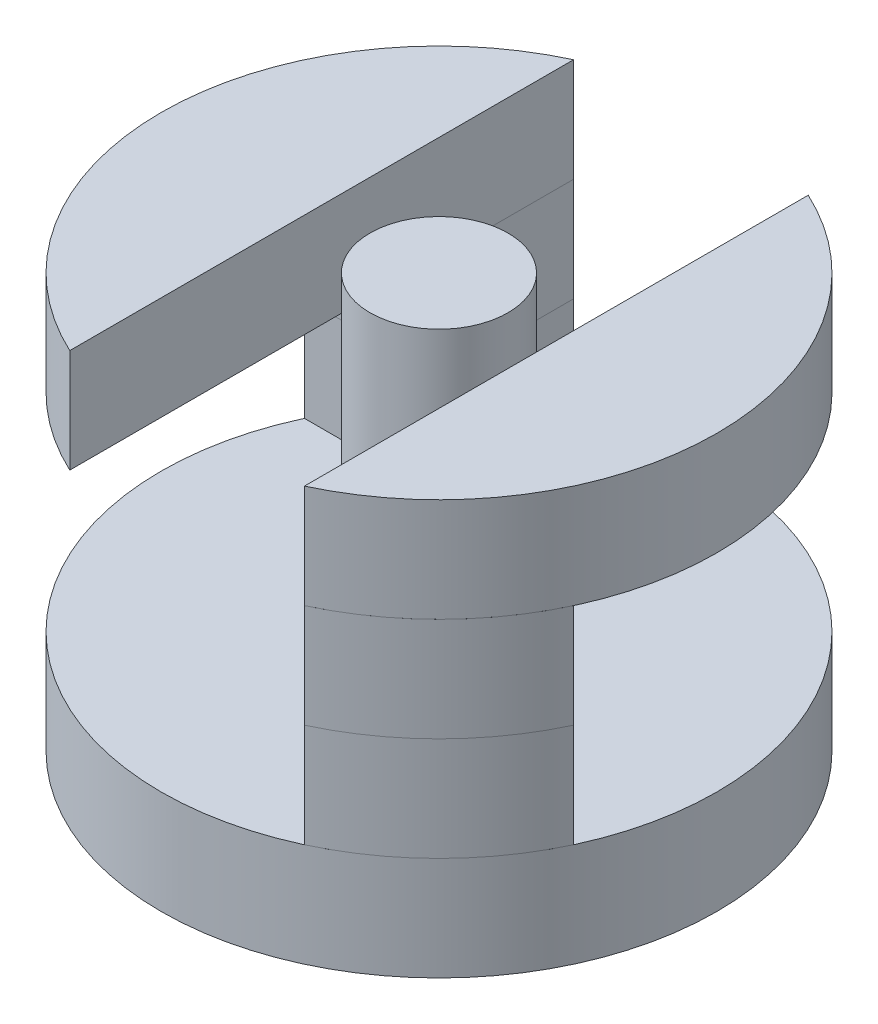
ISO-10303-21;
HEADER;
FILE_DESCRIPTION(('STEP AP214'),'2;1');
FILE_NAME('part.step','',(''),(''),'','','');
FILE_SCHEMA(('AUTOMOTIVE_DESIGN { 1 0 10303 214 1 1 1 1 }'));
ENDSEC;
DATA;
#1=APPLICATION_CONTEXT('core data for automotive mechanical design processes');
#2=APPLICATION_PROTOCOL_DEFINITION('international standard','automotive_design',2000,#1);
#3=PRODUCT_CONTEXT('',#1,'mechanical');
#4=PRODUCT('Part','Part','',(#3));
#5=PRODUCT_RELATED_PRODUCT_CATEGORY('part','',(#4));
#6=PRODUCT_DEFINITION_FORMATION('','',#4);
#7=PRODUCT_DEFINITION_CONTEXT('part definition',#1,'design');
#8=PRODUCT_DEFINITION('design','',#6,#7);
#9=PRODUCT_DEFINITION_SHAPE('','',#8);
#10=(LENGTH_UNIT() NAMED_UNIT(*) SI_UNIT(.MILLI.,.METRE.));
#11=(NAMED_UNIT(*) PLANE_ANGLE_UNIT() SI_UNIT($,.RADIAN.));
#12=(NAMED_UNIT(*) SI_UNIT($,.STERADIAN.) SOLID_ANGLE_UNIT());
#13=UNCERTAINTY_MEASURE_WITH_UNIT(LENGTH_MEASURE(1.E-05),#10,'distance_accuracy_value','');
#14=(GEOMETRIC_REPRESENTATION_CONTEXT(3) GLOBAL_UNCERTAINTY_ASSIGNED_CONTEXT((#13)) GLOBAL_UNIT_ASSIGNED_CONTEXT((#10,
#11,#12)) REPRESENTATION_CONTEXT('',''));
#15=CARTESIAN_POINT('',(0.,0.,0.));
#16=DIRECTION('',(0.,0.,1.));
#17=DIRECTION('',(1.,0.,0.));
#18=AXIS2_PLACEMENT_3D('',#15,#16,#17);
#19=CARTESIAN_POINT('',(-21.5900000000003,47.6250000000001,46.3483468102152));
#20=DIRECTION('',(1.,0.,0.));
#21=DIRECTION('',(0.,1.,0.));
#22=AXIS2_PLACEMENT_3D('',#19,#20,#21);
#23=PLANE('',#22);
#24=DIRECTION('',(0.,0.,-1.));
#25=VECTOR('',#24,1.);
#26=CARTESIAN_POINT('',(-21.5900000000003,66.6750000000001,46.3483468102152));
#27=LINE('',#26,#25);
#28=CARTESIAN_POINT('',(-21.5900000000003,66.6750000000001,46.3483468102152));
#29=VERTEX_POINT('',#28);
#30=CARTESIAN_POINT('',(-21.5899999999997,66.6750000000001,-46.3483468102155));
#31=VERTEX_POINT('',#30);
#32=EDGE_CURVE('P0_E48',#29,#31,#27,.T.);
#33=ORIENTED_EDGE('',*,*,#32,.F.);
#34=DIRECTION('',(0.,1.,0.));
#35=VECTOR('',#34,1.);
#36=CARTESIAN_POINT('',(-21.5900000000003,47.6250000000001,46.3483468102152));
#37=LINE('',#36,#35);
#38=CARTESIAN_POINT('',(-21.5900000000003,47.6250000000001,46.3483468102152));
#39=VERTEX_POINT('',#38);
#40=EDGE_CURVE('P0_E11',#39,#29,#37,.T.);
#41=ORIENTED_EDGE('',*,*,#40,.F.);
#42=DIRECTION('',(0.,0.,-1.));
#43=VECTOR('',#42,1.);
#44=CARTESIAN_POINT('',(-21.5900000000003,47.6250000000001,46.3483468102152));
#45=LINE('',#44,#43);
#46=CARTESIAN_POINT('',(-21.5899999999997,47.6250000000001,-46.3483468102155));
#47=VERTEX_POINT('',#46);
#48=EDGE_CURVE('P0_E49',#39,#47,#45,.T.);
#49=ORIENTED_EDGE('',*,*,#48,.T.);
#50=DIRECTION('',(0.,1.,0.));
#51=VECTOR('',#50,1.);
#52=CARTESIAN_POINT('',(-21.5899999999997,47.6250000000001,-46.3483468102155));
#53=LINE('',#52,#51);
#54=EDGE_CURVE('P0_E20',#47,#31,#53,.T.);
#55=ORIENTED_EDGE('',*,*,#54,.T.);
#56=EDGE_LOOP('',(#33,#41,#49,#55));
#57=FACE_BOUND('',#56,.T.);
#58=ADVANCED_FACE('P0_F17',(#57),#23,.T.);
#59=CARTESIAN_POINT('',(0.,47.6250000000001,0.));
#60=DIRECTION('',(0.,1.,0.));
#61=DIRECTION('',(-1.,0.,0.));
#62=AXIS2_PLACEMENT_3D('',#59,#60,#61);
#63=CYLINDRICAL_SURFACE('',#62,51.1302);
#64=CARTESIAN_POINT('',(0.,66.6750000000001,0.));
#65=DIRECTION('',(0.,-1.,0.));
#66=DIRECTION('',(1.,0.,0.));
#67=AXIS2_PLACEMENT_3D('',#64,#65,#66);
#68=CIRCLE('',#67,51.1302);
#69=EDGE_CURVE('P0_E42',#29,#31,#68,.T.);
#70=ORIENTED_EDGE('',*,*,#69,.T.);
#71=ORIENTED_EDGE('',*,*,#54,.F.);
#72=CARTESIAN_POINT('',(0.,47.6250000000001,0.));
#73=DIRECTION('',(0.,-1.,0.));
#74=DIRECTION('',(1.,0.,0.));
#75=AXIS2_PLACEMENT_3D('',#72,#73,#74);
#76=CIRCLE('',#75,51.1302);
#77=EDGE_CURVE('P0_E44',#39,#47,#76,.T.);
#78=ORIENTED_EDGE('',*,*,#77,.F.);
#79=ORIENTED_EDGE('',*,*,#40,.T.);
#80=EDGE_LOOP('',(#70,#71,#78,#79));
#81=FACE_BOUND('',#80,.T.);
#82=ADVANCED_FACE('P0_F41',(#81),#63,.T.);
#83=CARTESIAN_POINT('',(0.,47.6250000000001,0.));
#84=DIRECTION('',(0.,-1.,0.));
#85=DIRECTION('',(1.,0.,0.));
#86=AXIS2_PLACEMENT_3D('',#83,#84,#85);
#87=PLANE('',#86);
#88=ORIENTED_EDGE('',*,*,#48,.F.);
#89=ORIENTED_EDGE('',*,*,#77,.T.);
#90=EDGE_LOOP('',(#88,#89));
#91=FACE_BOUND('',#90,.T.);
#92=ADVANCED_FACE('P0_F55',(#91),#87,.T.);
#93=CARTESIAN_POINT('',(0.,66.6750000000001,0.));
#94=DIRECTION('',(0.,-1.,0.));
#95=DIRECTION('',(1.,0.,0.));
#96=AXIS2_PLACEMENT_3D('',#93,#94,#95);
#97=PLANE('',#96);
#98=ORIENTED_EDGE('',*,*,#32,.T.);
#99=ORIENTED_EDGE('',*,*,#69,.F.);
#100=EDGE_LOOP('',(#98,#99));
#101=FACE_BOUND('',#100,.T.);
#102=ADVANCED_FACE('P0_F47',(#101),#97,.F.);
#103=CLOSED_SHELL('',(#58,#82,#92,#102));
#104=MANIFOLD_SOLID_BREP('P0_B1',#103);
#105=CARTESIAN_POINT('',(21.5900000000003,66.6750000000001,46.3483468102152));
#106=DIRECTION('',(-1.,0.,0.));
#107=DIRECTION('',(0.,-1.,0.));
#108=AXIS2_PLACEMENT_3D('',#105,#106,#107);
#109=PLANE('',#108);
#110=DIRECTION('',(0.,0.,-1.));
#111=VECTOR('',#110,1.);
#112=CARTESIAN_POINT('',(21.5900000000003,47.6250000000001,46.3483468102152));
#113=LINE('',#112,#111);
#114=CARTESIAN_POINT('',(21.5900000000003,47.6250000000001,46.3483468102152));
#115=VERTEX_POINT('',#114);
#116=CARTESIAN_POINT('',(21.5899999999997,47.6250000000001,-46.3483468102155));
#117=VERTEX_POINT('',#116);
#118=EDGE_CURVE('P1_E48',#115,#117,#113,.T.);
#119=ORIENTED_EDGE('',*,*,#118,.F.);
#120=DIRECTION('',(0.,-1.,0.));
#121=VECTOR('',#120,1.);
#122=CARTESIAN_POINT('',(21.5900000000003,66.6750000000001,46.3483468102152));
#123=LINE('',#122,#121);
#124=CARTESIAN_POINT('',(21.5900000000003,66.6750000000001,46.3483468102152));
#125=VERTEX_POINT('',#124);
#126=EDGE_CURVE('P1_E11',#125,#115,#123,.T.);
#127=ORIENTED_EDGE('',*,*,#126,.F.);
#128=DIRECTION('',(0.,0.,-1.));
#129=VECTOR('',#128,1.);
#130=CARTESIAN_POINT('',(21.5900000000003,66.6750000000001,46.3483468102152));
#131=LINE('',#130,#129);
#132=CARTESIAN_POINT('',(21.5899999999997,66.6750000000001,-46.3483468102155));
#133=VERTEX_POINT('',#132);
#134=EDGE_CURVE('P1_E49',#125,#133,#131,.T.);
#135=ORIENTED_EDGE('',*,*,#134,.T.);
#136=DIRECTION('',(0.,-1.,0.));
#137=VECTOR('',#136,1.);
#138=CARTESIAN_POINT('',(21.5899999999997,66.6750000000001,-46.3483468102155));
#139=LINE('',#138,#137);
#140=EDGE_CURVE('P1_E20',#133,#117,#139,.T.);
#141=ORIENTED_EDGE('',*,*,#140,.T.);
#142=EDGE_LOOP('',(#119,#127,#135,#141));
#143=FACE_BOUND('',#142,.T.);
#144=ADVANCED_FACE('P1_F17',(#143),#109,.T.);
#145=CARTESIAN_POINT('',(0.,66.6750000000001,0.));
#146=DIRECTION('',(0.,-1.,0.));
#147=DIRECTION('',(1.,0.,0.));
#148=AXIS2_PLACEMENT_3D('',#145,#146,#147);
#149=CYLINDRICAL_SURFACE('',#148,51.1302);
#150=CARTESIAN_POINT('',(0.,47.6250000000001,0.));
#151=DIRECTION('',(0.,1.,0.));
#152=DIRECTION('',(-1.,0.,0.));
#153=AXIS2_PLACEMENT_3D('',#150,#151,#152);
#154=CIRCLE('',#153,51.1302);
#155=EDGE_CURVE('P1_E42',#115,#117,#154,.T.);
#156=ORIENTED_EDGE('',*,*,#155,.T.);
#157=ORIENTED_EDGE('',*,*,#140,.F.);
#158=CARTESIAN_POINT('',(0.,66.6750000000001,0.));
#159=DIRECTION('',(0.,1.,0.));
#160=DIRECTION('',(-1.,0.,0.));
#161=AXIS2_PLACEMENT_3D('',#158,#159,#160);
#162=CIRCLE('',#161,51.1302);
#163=EDGE_CURVE('P1_E44',#125,#133,#162,.T.);
#164=ORIENTED_EDGE('',*,*,#163,.F.);
#165=ORIENTED_EDGE('',*,*,#126,.T.);
#166=EDGE_LOOP('',(#156,#157,#164,#165));
#167=FACE_BOUND('',#166,.T.);
#168=ADVANCED_FACE('P1_F41',(#167),#149,.T.);
#169=CARTESIAN_POINT('',(0.,66.6750000000001,0.));
#170=DIRECTION('',(0.,1.,0.));
#171=DIRECTION('',(-1.,0.,0.));
#172=AXIS2_PLACEMENT_3D('',#169,#170,#171);
#173=PLANE('',#172);
#174=ORIENTED_EDGE('',*,*,#134,.F.);
#175=ORIENTED_EDGE('',*,*,#163,.T.);
#176=EDGE_LOOP('',(#174,#175));
#177=FACE_BOUND('',#176,.T.);
#178=ADVANCED_FACE('P1_F55',(#177),#173,.T.);
#179=CARTESIAN_POINT('',(0.,47.6250000000001,0.));
#180=DIRECTION('',(0.,1.,0.));
#181=DIRECTION('',(-1.,0.,0.));
#182=AXIS2_PLACEMENT_3D('',#179,#180,#181);
#183=PLANE('',#182);
#184=ORIENTED_EDGE('',*,*,#118,.T.);
#185=ORIENTED_EDGE('',*,*,#155,.F.);
#186=EDGE_LOOP('',(#184,#185));
#187=FACE_BOUND('',#186,.T.);
#188=ADVANCED_FACE('P1_F47',(#187),#183,.F.);
#189=CLOSED_SHELL('',(#144,#168,#178,#188));
#190=MANIFOLD_SOLID_BREP('P1_B1',#189);
#191=CARTESIAN_POINT('',(46.3483468102153,9.525,21.59));
#192=DIRECTION('',(0.,0.,-1.));
#193=DIRECTION('',(1.,0.,0.));
#194=AXIS2_PLACEMENT_3D('',#191,#192,#193);
#195=PLANE('',#194);
#196=DIRECTION('',(-1.,0.,0.));
#197=VECTOR('',#196,1.);
#198=CARTESIAN_POINT('',(46.3483468102153,28.575,21.59));
#199=LINE('',#198,#197);
#200=CARTESIAN_POINT('',(46.3483468102153,28.575,21.59));
#201=VERTEX_POINT('',#200);
#202=CARTESIAN_POINT('',(21.59,28.575,21.59));
#203=VERTEX_POINT('',#202);
#204=EDGE_CURVE('P2_E69',#201,#203,#199,.T.);
#205=ORIENTED_EDGE('',*,*,#204,.F.);
#206=DIRECTION('',(0.,1.,0.));
#207=VECTOR('',#206,1.);
#208=CARTESIAN_POINT('',(46.3483468102153,9.525,21.59));
#209=LINE('',#208,#207);
#210=CARTESIAN_POINT('',(46.3483468102153,9.525,21.59));
#211=VERTEX_POINT('',#210);
#212=EDGE_CURVE('P2_E11',#211,#201,#209,.T.);
#213=ORIENTED_EDGE('',*,*,#212,.F.);
#214=DIRECTION('',(-1.,0.,0.));
#215=VECTOR('',#214,1.);
#216=CARTESIAN_POINT('',(46.3483468102153,9.525,21.59));
#217=LINE('',#216,#215);
#218=CARTESIAN_POINT('',(21.59,9.525,21.59));
#219=VERTEX_POINT('',#218);
#220=EDGE_CURVE('P2_E62',#211,#219,#217,.T.);
#221=ORIENTED_EDGE('',*,*,#220,.T.);
#222=DIRECTION('',(0.,1.,0.));
#223=VECTOR('',#222,1.);
#224=CARTESIAN_POINT('',(21.59,9.525,21.59));
#225=LINE('',#224,#223);
#226=EDGE_CURVE('P2_E20',#219,#203,#225,.T.);
#227=ORIENTED_EDGE('',*,*,#226,.T.);
#228=EDGE_LOOP('',(#205,#213,#221,#227));
#229=FACE_BOUND('',#228,.T.);
#230=ADVANCED_FACE('P2_F17',(#229),#195,.T.);
#231=CARTESIAN_POINT('',(0.,9.525,0.));
#232=DIRECTION('',(0.,1.,0.));
#233=DIRECTION('',(0.,0.,-1.));
#234=AXIS2_PLACEMENT_3D('',#231,#232,#233);
#235=CYLINDRICAL_SURFACE('',#234,51.1302);
#236=CARTESIAN_POINT('',(0.,28.575,0.));
#237=DIRECTION('',(0.,-1.,0.));
#238=DIRECTION('',(0.,0.,1.));
#239=AXIS2_PLACEMENT_3D('',#236,#237,#238);
#240=CIRCLE('',#239,51.1302);
#241=CARTESIAN_POINT('',(21.59,28.575,46.3483468102154));
#242=VERTEX_POINT('',#241);
#243=EDGE_CURVE('P2_E64',#201,#242,#240,.T.);
#244=ORIENTED_EDGE('',*,*,#243,.T.);
#245=DIRECTION('',(0.,1.,0.));
#246=VECTOR('',#245,1.);
#247=CARTESIAN_POINT('',(21.59,9.525,46.3483468102154));
#248=LINE('',#247,#246);
#249=CARTESIAN_POINT('',(21.59,9.525,46.3483468102154));
#250=VERTEX_POINT('',#249);
#251=EDGE_CURVE('P2_E26',#250,#242,#248,.T.);
#252=ORIENTED_EDGE('',*,*,#251,.F.);
#253=CARTESIAN_POINT('',(0.,9.525,0.));
#254=DIRECTION('',(0.,-1.,0.));
#255=DIRECTION('',(0.,0.,1.));
#256=AXIS2_PLACEMENT_3D('',#253,#254,#255);
#257=CIRCLE('',#256,51.1302);
#258=EDGE_CURVE('P2_E58',#211,#250,#257,.T.);
#259=ORIENTED_EDGE('',*,*,#258,.F.);
#260=ORIENTED_EDGE('',*,*,#212,.T.);
#261=EDGE_LOOP('',(#244,#252,#259,#260));
#262=FACE_BOUND('',#261,.T.);
#263=ADVANCED_FACE('P2_F73',(#262),#235,.T.);
#264=CARTESIAN_POINT('',(21.59,9.525,21.59));
#265=DIRECTION('',(-1.,0.,0.));
#266=DIRECTION('',(0.,-1.,0.));
#267=AXIS2_PLACEMENT_3D('',#264,#265,#266);
#268=PLANE('',#267);
#269=DIRECTION('',(0.,0.,1.));
#270=VECTOR('',#269,1.);
#271=CARTESIAN_POINT('',(21.59,28.575,21.59));
#272=LINE('',#271,#270);
#273=EDGE_CURVE('P2_E56',#203,#242,#272,.T.);
#274=ORIENTED_EDGE('',*,*,#273,.F.);
#275=ORIENTED_EDGE('',*,*,#226,.F.);
#276=DIRECTION('',(0.,0.,1.));
#277=VECTOR('',#276,1.);
#278=CARTESIAN_POINT('',(21.59,9.525,21.59));
#279=LINE('',#278,#277);
#280=EDGE_CURVE('P2_E54',#219,#250,#279,.T.);
#281=ORIENTED_EDGE('',*,*,#280,.T.);
#282=ORIENTED_EDGE('',*,*,#251,.T.);
#283=EDGE_LOOP('',(#274,#275,#281,#282));
#284=FACE_BOUND('',#283,.T.);
#285=ADVANCED_FACE('P2_F53',(#284),#268,.T.);
#286=CARTESIAN_POINT('',(0.,9.525,0.));
#287=DIRECTION('',(0.,-1.,0.));
#288=DIRECTION('',(0.,0.,1.));
#289=AXIS2_PLACEMENT_3D('',#286,#287,#288);
#290=PLANE('',#289);
#291=ORIENTED_EDGE('',*,*,#220,.F.);
#292=ORIENTED_EDGE('',*,*,#258,.T.);
#293=ORIENTED_EDGE('',*,*,#280,.F.);
#294=EDGE_LOOP('',(#291,#292,#293));
#295=FACE_BOUND('',#294,.T.);
#296=ADVANCED_FACE('P2_F61',(#295),#290,.T.);
#297=CARTESIAN_POINT('',(0.,28.575,0.));
#298=DIRECTION('',(0.,-1.,0.));
#299=DIRECTION('',(0.,0.,1.));
#300=AXIS2_PLACEMENT_3D('',#297,#298,#299);
#301=PLANE('',#300);
#302=ORIENTED_EDGE('',*,*,#204,.T.);
#303=ORIENTED_EDGE('',*,*,#273,.T.);
#304=ORIENTED_EDGE('',*,*,#243,.F.);
#305=EDGE_LOOP('',(#302,#303,#304));
#306=FACE_BOUND('',#305,.T.);
#307=ADVANCED_FACE('P2_F72',(#306),#301,.F.);
#308=CLOSED_SHELL('',(#230,#263,#285,#296,#307));
#309=MANIFOLD_SOLID_BREP('P2_B1',#308);
#310=CARTESIAN_POINT('',(-46.3483468102152,9.525,-21.5900000000003));
#311=DIRECTION('',(0.,0.,1.));
#312=DIRECTION('',(-1.,0.,0.));
#313=AXIS2_PLACEMENT_3D('',#310,#311,#312);
#314=PLANE('',#313);
#315=DIRECTION('',(1.,0.,0.));
#316=VECTOR('',#315,1.);
#317=CARTESIAN_POINT('',(-46.3483468102152,28.575,-21.5900000000003));
#318=LINE('',#317,#316);
#319=CARTESIAN_POINT('',(-46.3483468102152,28.575,-21.5900000000003));
#320=VERTEX_POINT('',#319);
#321=CARTESIAN_POINT('',(-21.5899999999998,28.575,-21.5900000000002));
#322=VERTEX_POINT('',#321);
#323=EDGE_CURVE('P3_E69',#320,#322,#318,.T.);
#324=ORIENTED_EDGE('',*,*,#323,.F.);
#325=DIRECTION('',(0.,1.,0.));
#326=VECTOR('',#325,1.);
#327=CARTESIAN_POINT('',(-46.3483468102152,9.525,-21.5900000000003));
#328=LINE('',#327,#326);
#329=CARTESIAN_POINT('',(-46.3483468102152,9.525,-21.5900000000003));
#330=VERTEX_POINT('',#329);
#331=EDGE_CURVE('P3_E11',#330,#320,#328,.T.);
#332=ORIENTED_EDGE('',*,*,#331,.F.);
#333=DIRECTION('',(1.,0.,0.));
#334=VECTOR('',#333,1.);
#335=CARTESIAN_POINT('',(-46.3483468102152,9.525,-21.5900000000003));
#336=LINE('',#335,#334);
#337=CARTESIAN_POINT('',(-21.5899999999998,9.525,-21.5900000000002));
#338=VERTEX_POINT('',#337);
#339=EDGE_CURVE('P3_E62',#330,#338,#336,.T.);
#340=ORIENTED_EDGE('',*,*,#339,.T.);
#341=DIRECTION('',(0.,1.,0.));
#342=VECTOR('',#341,1.);
#343=CARTESIAN_POINT('',(-21.5899999999998,9.525,-21.5900000000002));
#344=LINE('',#343,#342);
#345=EDGE_CURVE('P3_E20',#338,#322,#344,.T.);
#346=ORIENTED_EDGE('',*,*,#345,.T.);
#347=EDGE_LOOP('',(#324,#332,#340,#346));
#348=FACE_BOUND('',#347,.T.);
#349=ADVANCED_FACE('P3_F17',(#348),#314,.T.);
#350=CARTESIAN_POINT('',(0.,9.525,0.));
#351=DIRECTION('',(0.,1.,0.));
#352=DIRECTION('',(0.,0.,1.));
#353=AXIS2_PLACEMENT_3D('',#350,#351,#352);
#354=CYLINDRICAL_SURFACE('',#353,51.1302);
#355=CARTESIAN_POINT('',(0.,28.575,0.));
#356=DIRECTION('',(0.,-1.,0.));
#357=DIRECTION('',(0.,0.,-1.));
#358=AXIS2_PLACEMENT_3D('',#355,#356,#357);
#359=CIRCLE('',#358,51.1302);
#360=CARTESIAN_POINT('',(-21.5899999999997,28.575,-46.3483468102155));
#361=VERTEX_POINT('',#360);
#362=EDGE_CURVE('P3_E64',#320,#361,#359,.T.);
#363=ORIENTED_EDGE('',*,*,#362,.T.);
#364=DIRECTION('',(0.,1.,0.));
#365=VECTOR('',#364,1.);
#366=CARTESIAN_POINT('',(-21.5899999999997,9.525,-46.3483468102155));
#367=LINE('',#366,#365);
#368=CARTESIAN_POINT('',(-21.5899999999997,9.525,-46.3483468102155));
#369=VERTEX_POINT('',#368);
#370=EDGE_CURVE('P3_E26',#369,#361,#367,.T.);
#371=ORIENTED_EDGE('',*,*,#370,.F.);
#372=CARTESIAN_POINT('',(0.,9.525,0.));
#373=DIRECTION('',(0.,-1.,0.));
#374=DIRECTION('',(0.,0.,-1.));
#375=AXIS2_PLACEMENT_3D('',#372,#373,#374);
#376=CIRCLE('',#375,51.1302);
#377=EDGE_CURVE('P3_E58',#330,#369,#376,.T.);
#378=ORIENTED_EDGE('',*,*,#377,.F.);
#379=ORIENTED_EDGE('',*,*,#331,.T.);
#380=EDGE_LOOP('',(#363,#371,#378,#379));
#381=FACE_BOUND('',#380,.T.);
#382=ADVANCED_FACE('P3_F73',(#381),#354,.T.);
#383=CARTESIAN_POINT('',(-21.5899999999998,9.525,-21.5900000000002));
#384=DIRECTION('',(1.,0.,0.));
#385=DIRECTION('',(0.,-1.,0.));
#386=AXIS2_PLACEMENT_3D('',#383,#384,#385);
#387=PLANE('',#386);
#388=DIRECTION('',(0.,0.,-1.));
#389=VECTOR('',#388,1.);
#390=CARTESIAN_POINT('',(-21.5899999999998,28.575,-21.5900000000002));
#391=LINE('',#390,#389);
#392=EDGE_CURVE('P3_E56',#322,#361,#391,.T.);
#393=ORIENTED_EDGE('',*,*,#392,.F.);
#394=ORIENTED_EDGE('',*,*,#345,.F.);
#395=DIRECTION('',(0.,0.,-1.));
#396=VECTOR('',#395,1.);
#397=CARTESIAN_POINT('',(-21.5899999999998,9.525,-21.5900000000002));
#398=LINE('',#397,#396);
#399=EDGE_CURVE('P3_E54',#338,#369,#398,.T.);
#400=ORIENTED_EDGE('',*,*,#399,.T.);
#401=ORIENTED_EDGE('',*,*,#370,.T.);
#402=EDGE_LOOP('',(#393,#394,#400,#401));
#403=FACE_BOUND('',#402,.T.);
#404=ADVANCED_FACE('P3_F53',(#403),#387,.T.);
#405=CARTESIAN_POINT('',(0.,9.525,0.));
#406=DIRECTION('',(0.,-1.,0.));
#407=DIRECTION('',(0.,0.,-1.));
#408=AXIS2_PLACEMENT_3D('',#405,#406,#407);
#409=PLANE('',#408);
#410=ORIENTED_EDGE('',*,*,#339,.F.);
#411=ORIENTED_EDGE('',*,*,#377,.T.);
#412=ORIENTED_EDGE('',*,*,#399,.F.);
#413=EDGE_LOOP('',(#410,#411,#412));
#414=FACE_BOUND('',#413,.T.);
#415=ADVANCED_FACE('P3_F61',(#414),#409,.T.);
#416=CARTESIAN_POINT('',(0.,28.575,0.));
#417=DIRECTION('',(0.,-1.,0.));
#418=DIRECTION('',(0.,0.,-1.));
#419=AXIS2_PLACEMENT_3D('',#416,#417,#418);
#420=PLANE('',#419);
#421=ORIENTED_EDGE('',*,*,#323,.T.);
#422=ORIENTED_EDGE('',*,*,#392,.T.);
#423=ORIENTED_EDGE('',*,*,#362,.F.);
#424=EDGE_LOOP('',(#421,#422,#423));
#425=FACE_BOUND('',#424,.T.);
#426=ADVANCED_FACE('P3_F72',(#425),#420,.F.);
#427=CLOSED_SHELL('',(#349,#382,#404,#415,#426));
#428=MANIFOLD_SOLID_BREP('P3_B1',#427);
#429=CARTESIAN_POINT('',(46.3483468102153,28.575,21.59));
#430=DIRECTION('',(0.,0.,-1.));
#431=DIRECTION('',(1.,0.,0.));
#432=AXIS2_PLACEMENT_3D('',#429,#430,#431);
#433=PLANE('',#432);
#434=DIRECTION('',(-1.,0.,0.));
#435=VECTOR('',#434,1.);
#436=CARTESIAN_POINT('',(46.3483468102153,47.625,21.59));
#437=LINE('',#436,#435);
#438=CARTESIAN_POINT('',(46.3483468102153,47.625,21.59));
#439=VERTEX_POINT('',#438);
#440=CARTESIAN_POINT('',(21.59,47.625,21.59));
#441=VERTEX_POINT('',#440);
#442=EDGE_CURVE('P4_E69',#439,#441,#437,.T.);
#443=ORIENTED_EDGE('',*,*,#442,.F.);
#444=DIRECTION('',(0.,1.,0.));
#445=VECTOR('',#444,1.);
#446=CARTESIAN_POINT('',(46.3483468102153,28.575,21.59));
#447=LINE('',#446,#445);
#448=CARTESIAN_POINT('',(46.3483468102153,28.575,21.59));
#449=VERTEX_POINT('',#448);
#450=EDGE_CURVE('P4_E11',#449,#439,#447,.T.);
#451=ORIENTED_EDGE('',*,*,#450,.F.);
#452=DIRECTION('',(-1.,0.,0.));
#453=VECTOR('',#452,1.);
#454=CARTESIAN_POINT('',(46.3483468102153,28.575,21.59));
#455=LINE('',#454,#453);
#456=CARTESIAN_POINT('',(21.59,28.575,21.59));
#457=VERTEX_POINT('',#456);
#458=EDGE_CURVE('P4_E62',#449,#457,#455,.T.);
#459=ORIENTED_EDGE('',*,*,#458,.T.);
#460=DIRECTION('',(0.,1.,0.));
#461=VECTOR('',#460,1.);
#462=CARTESIAN_POINT('',(21.59,28.575,21.59));
#463=LINE('',#462,#461);
#464=EDGE_CURVE('P4_E20',#457,#441,#463,.T.);
#465=ORIENTED_EDGE('',*,*,#464,.T.);
#466=EDGE_LOOP('',(#443,#451,#459,#465));
#467=FACE_BOUND('',#466,.T.);
#468=ADVANCED_FACE('P4_F17',(#467),#433,.T.);
#469=CARTESIAN_POINT('',(0.,28.575,0.));
#470=DIRECTION('',(0.,1.,0.));
#471=DIRECTION('',(0.,0.,-1.));
#472=AXIS2_PLACEMENT_3D('',#469,#470,#471);
#473=CYLINDRICAL_SURFACE('',#472,51.1302);
#474=CARTESIAN_POINT('',(0.,47.625,0.));
#475=DIRECTION('',(0.,-1.,0.));
#476=DIRECTION('',(0.,0.,1.));
#477=AXIS2_PLACEMENT_3D('',#474,#475,#476);
#478=CIRCLE('',#477,51.1302);
#479=CARTESIAN_POINT('',(21.59,47.625,46.3483468102154));
#480=VERTEX_POINT('',#479);
#481=EDGE_CURVE('P4_E64',#439,#480,#478,.T.);
#482=ORIENTED_EDGE('',*,*,#481,.T.);
#483=DIRECTION('',(0.,1.,0.));
#484=VECTOR('',#483,1.);
#485=CARTESIAN_POINT('',(21.59,28.575,46.3483468102154));
#486=LINE('',#485,#484);
#487=CARTESIAN_POINT('',(21.59,28.575,46.3483468102154));
#488=VERTEX_POINT('',#487);
#489=EDGE_CURVE('P4_E26',#488,#480,#486,.T.);
#490=ORIENTED_EDGE('',*,*,#489,.F.);
#491=CARTESIAN_POINT('',(0.,28.575,0.));
#492=DIRECTION('',(0.,-1.,0.));
#493=DIRECTION('',(0.,0.,1.));
#494=AXIS2_PLACEMENT_3D('',#491,#492,#493);
#495=CIRCLE('',#494,51.1302);
#496=EDGE_CURVE('P4_E58',#449,#488,#495,.T.);
#497=ORIENTED_EDGE('',*,*,#496,.F.);
#498=ORIENTED_EDGE('',*,*,#450,.T.);
#499=EDGE_LOOP('',(#482,#490,#497,#498));
#500=FACE_BOUND('',#499,.T.);
#501=ADVANCED_FACE('P4_F73',(#500),#473,.T.);
#502=CARTESIAN_POINT('',(21.59,28.575,21.59));
#503=DIRECTION('',(-1.,0.,0.));
#504=DIRECTION('',(0.,-1.,0.));
#505=AXIS2_PLACEMENT_3D('',#502,#503,#504);
#506=PLANE('',#505);
#507=DIRECTION('',(0.,0.,1.));
#508=VECTOR('',#507,1.);
#509=CARTESIAN_POINT('',(21.59,47.625,21.59));
#510=LINE('',#509,#508);
#511=EDGE_CURVE('P4_E56',#441,#480,#510,.T.);
#512=ORIENTED_EDGE('',*,*,#511,.F.);
#513=ORIENTED_EDGE('',*,*,#464,.F.);
#514=DIRECTION('',(0.,0.,1.));
#515=VECTOR('',#514,1.);
#516=CARTESIAN_POINT('',(21.59,28.575,21.59));
#517=LINE('',#516,#515);
#518=EDGE_CURVE('P4_E54',#457,#488,#517,.T.);
#519=ORIENTED_EDGE('',*,*,#518,.T.);
#520=ORIENTED_EDGE('',*,*,#489,.T.);
#521=EDGE_LOOP('',(#512,#513,#519,#520));
#522=FACE_BOUND('',#521,.T.);
#523=ADVANCED_FACE('P4_F53',(#522),#506,.T.);
#524=CARTESIAN_POINT('',(0.,28.575,0.));
#525=DIRECTION('',(0.,-1.,0.));
#526=DIRECTION('',(0.,0.,1.));
#527=AXIS2_PLACEMENT_3D('',#524,#525,#526);
#528=PLANE('',#527);
#529=ORIENTED_EDGE('',*,*,#458,.F.);
#530=ORIENTED_EDGE('',*,*,#496,.T.);
#531=ORIENTED_EDGE('',*,*,#518,.F.);
#532=EDGE_LOOP('',(#529,#530,#531));
#533=FACE_BOUND('',#532,.T.);
#534=ADVANCED_FACE('P4_F61',(#533),#528,.T.);
#535=CARTESIAN_POINT('',(0.,47.625,0.));
#536=DIRECTION('',(0.,-1.,0.));
#537=DIRECTION('',(0.,0.,1.));
#538=AXIS2_PLACEMENT_3D('',#535,#536,#537);
#539=PLANE('',#538);
#540=ORIENTED_EDGE('',*,*,#442,.T.);
#541=ORIENTED_EDGE('',*,*,#511,.T.);
#542=ORIENTED_EDGE('',*,*,#481,.F.);
#543=EDGE_LOOP('',(#540,#541,#542));
#544=FACE_BOUND('',#543,.T.);
#545=ADVANCED_FACE('P4_F72',(#544),#539,.F.);
#546=CLOSED_SHELL('',(#468,#501,#523,#534,#545));
#547=MANIFOLD_SOLID_BREP('P4_B1',#546);
#548=CARTESIAN_POINT('',(-46.3483468102152,28.575,-21.5900000000003));
#549=DIRECTION('',(0.,0.,1.));
#550=DIRECTION('',(-1.,0.,0.));
#551=AXIS2_PLACEMENT_3D('',#548,#549,#550);
#552=PLANE('',#551);
#553=DIRECTION('',(1.,0.,0.));
#554=VECTOR('',#553,1.);
#555=CARTESIAN_POINT('',(-46.3483468102152,47.625,-21.5900000000003));
#556=LINE('',#555,#554);
#557=CARTESIAN_POINT('',(-46.3483468102152,47.625,-21.5900000000003));
#558=VERTEX_POINT('',#557);
#559=CARTESIAN_POINT('',(-21.5899999999998,47.625,-21.5900000000002));
#560=VERTEX_POINT('',#559);
#561=EDGE_CURVE('P5_E69',#558,#560,#556,.T.);
#562=ORIENTED_EDGE('',*,*,#561,.F.);
#563=DIRECTION('',(0.,1.,0.));
#564=VECTOR('',#563,1.);
#565=CARTESIAN_POINT('',(-46.3483468102152,28.575,-21.5900000000003));
#566=LINE('',#565,#564);
#567=CARTESIAN_POINT('',(-46.3483468102152,28.575,-21.5900000000003));
#568=VERTEX_POINT('',#567);
#569=EDGE_CURVE('P5_E11',#568,#558,#566,.T.);
#570=ORIENTED_EDGE('',*,*,#569,.F.);
#571=DIRECTION('',(1.,0.,0.));
#572=VECTOR('',#571,1.);
#573=CARTESIAN_POINT('',(-46.3483468102152,28.575,-21.5900000000003));
#574=LINE('',#573,#572);
#575=CARTESIAN_POINT('',(-21.5899999999998,28.575,-21.5900000000002));
#576=VERTEX_POINT('',#575);
#577=EDGE_CURVE('P5_E62',#568,#576,#574,.T.);
#578=ORIENTED_EDGE('',*,*,#577,.T.);
#579=DIRECTION('',(0.,1.,0.));
#580=VECTOR('',#579,1.);
#581=CARTESIAN_POINT('',(-21.5899999999998,28.575,-21.5900000000002));
#582=LINE('',#581,#580);
#583=EDGE_CURVE('P5_E20',#576,#560,#582,.T.);
#584=ORIENTED_EDGE('',*,*,#583,.T.);
#585=EDGE_LOOP('',(#562,#570,#578,#584));
#586=FACE_BOUND('',#585,.T.);
#587=ADVANCED_FACE('P5_F17',(#586),#552,.T.);
#588=CARTESIAN_POINT('',(0.,28.575,0.));
#589=DIRECTION('',(0.,1.,0.));
#590=DIRECTION('',(0.,0.,1.));
#591=AXIS2_PLACEMENT_3D('',#588,#589,#590);
#592=CYLINDRICAL_SURFACE('',#591,51.1302);
#593=CARTESIAN_POINT('',(0.,47.625,0.));
#594=DIRECTION('',(0.,-1.,0.));
#595=DIRECTION('',(0.,0.,-1.));
#596=AXIS2_PLACEMENT_3D('',#593,#594,#595);
#597=CIRCLE('',#596,51.1302);
#598=CARTESIAN_POINT('',(-21.5899999999997,47.625,-46.3483468102155));
#599=VERTEX_POINT('',#598);
#600=EDGE_CURVE('P5_E64',#558,#599,#597,.T.);
#601=ORIENTED_EDGE('',*,*,#600,.T.);
#602=DIRECTION('',(0.,1.,0.));
#603=VECTOR('',#602,1.);
#604=CARTESIAN_POINT('',(-21.5899999999997,28.575,-46.3483468102155));
#605=LINE('',#604,#603);
#606=CARTESIAN_POINT('',(-21.5899999999997,28.575,-46.3483468102155));
#607=VERTEX_POINT('',#606);
#608=EDGE_CURVE('P5_E26',#607,#599,#605,.T.);
#609=ORIENTED_EDGE('',*,*,#608,.F.);
#610=CARTESIAN_POINT('',(0.,28.575,0.));
#611=DIRECTION('',(0.,-1.,0.));
#612=DIRECTION('',(0.,0.,-1.));
#613=AXIS2_PLACEMENT_3D('',#610,#611,#612);
#614=CIRCLE('',#613,51.1302);
#615=EDGE_CURVE('P5_E58',#568,#607,#614,.T.);
#616=ORIENTED_EDGE('',*,*,#615,.F.);
#617=ORIENTED_EDGE('',*,*,#569,.T.);
#618=EDGE_LOOP('',(#601,#609,#616,#617));
#619=FACE_BOUND('',#618,.T.);
#620=ADVANCED_FACE('P5_F73',(#619),#592,.T.);
#621=CARTESIAN_POINT('',(-21.5899999999998,28.575,-21.5900000000002));
#622=DIRECTION('',(1.,0.,0.));
#623=DIRECTION('',(0.,-1.,0.));
#624=AXIS2_PLACEMENT_3D('',#621,#622,#623);
#625=PLANE('',#624);
#626=DIRECTION('',(0.,0.,-1.));
#627=VECTOR('',#626,1.);
#628=CARTESIAN_POINT('',(-21.5899999999998,47.625,-21.5900000000002));
#629=LINE('',#628,#627);
#630=EDGE_CURVE('P5_E56',#560,#599,#629,.T.);
#631=ORIENTED_EDGE('',*,*,#630,.F.);
#632=ORIENTED_EDGE('',*,*,#583,.F.);
#633=DIRECTION('',(0.,0.,-1.));
#634=VECTOR('',#633,1.);
#635=CARTESIAN_POINT('',(-21.5899999999998,28.575,-21.5900000000002));
#636=LINE('',#635,#634);
#637=EDGE_CURVE('P5_E54',#576,#607,#636,.T.);
#638=ORIENTED_EDGE('',*,*,#637,.T.);
#639=ORIENTED_EDGE('',*,*,#608,.T.);
#640=EDGE_LOOP('',(#631,#632,#638,#639));
#641=FACE_BOUND('',#640,.T.);
#642=ADVANCED_FACE('P5_F53',(#641),#625,.T.);
#643=CARTESIAN_POINT('',(0.,28.575,0.));
#644=DIRECTION('',(0.,-1.,0.));
#645=DIRECTION('',(0.,0.,-1.));
#646=AXIS2_PLACEMENT_3D('',#643,#644,#645);
#647=PLANE('',#646);
#648=ORIENTED_EDGE('',*,*,#577,.F.);
#649=ORIENTED_EDGE('',*,*,#615,.T.);
#650=ORIENTED_EDGE('',*,*,#637,.F.);
#651=EDGE_LOOP('',(#648,#649,#650));
#652=FACE_BOUND('',#651,.T.);
#653=ADVANCED_FACE('P5_F61',(#652),#647,.T.);
#654=CARTESIAN_POINT('',(0.,47.625,0.));
#655=DIRECTION('',(0.,-1.,0.));
#656=DIRECTION('',(0.,0.,-1.));
#657=AXIS2_PLACEMENT_3D('',#654,#655,#656);
#658=PLANE('',#657);
#659=ORIENTED_EDGE('',*,*,#561,.T.);
#660=ORIENTED_EDGE('',*,*,#630,.T.);
#661=ORIENTED_EDGE('',*,*,#600,.F.);
#662=EDGE_LOOP('',(#659,#660,#661));
#663=FACE_BOUND('',#662,.T.);
#664=ADVANCED_FACE('P5_F72',(#663),#658,.F.);
#665=CLOSED_SHELL('',(#587,#620,#642,#653,#664));
#666=MANIFOLD_SOLID_BREP('P5_B1',#665);
#667=CARTESIAN_POINT('',(0.,9.525,0.));
#668=DIRECTION('',(0.,-1.,0.));
#669=DIRECTION('',(0.,0.,-1.));
#670=AXIS2_PLACEMENT_3D('',#667,#668,#669);
#671=CYLINDRICAL_SURFACE('',#670,51.1302);
#672=CARTESIAN_POINT('',(0.,9.525,0.));
#673=DIRECTION('',(0.,1.,0.));
#674=DIRECTION('',(0.,0.,1.));
#675=AXIS2_PLACEMENT_3D('',#672,#673,#674);
#676=CIRCLE('',#675,51.1302);
#677=CARTESIAN_POINT('',(0.,9.525,-51.1302));
#678=VERTEX_POINT('',#677);
#679=EDGE_CURVE('P6_E23',#678,#678,#676,.T.);
#680=CARTESIAN_POINT('',(0.,-9.525,0.));
#681=DIRECTION('',(0.,1.,0.));
#682=DIRECTION('',(0.,0.,1.));
#683=AXIS2_PLACEMENT_3D('',#680,#681,#682);
#684=CIRCLE('',#683,51.1302);
#685=CARTESIAN_POINT('',(0.,-9.525,-51.1302));
#686=VERTEX_POINT('',#685);
#687=EDGE_CURVE('P6_E18',#686,#686,#684,.T.);
#688=CARTESIAN_POINT('',(0.,9.525,-51.1302));
#689=CARTESIAN_POINT('',(0.,9.3265625,-51.1302));
#690=CARTESIAN_POINT('',(0.,9.128125,-51.1302));
#691=CARTESIAN_POINT('',(0.,8.73125,-51.1302));
#692=CARTESIAN_POINT('',(0.,8.5328125,-51.1302));
#693=CARTESIAN_POINT('',(0.,8.1359375,-51.1302));
#694=CARTESIAN_POINT('',(0.,7.9375,-51.1302));
#695=CARTESIAN_POINT('',(0.,7.540625,-51.1302));
#696=CARTESIAN_POINT('',(0.,7.3421875,-51.1302));
#697=CARTESIAN_POINT('',(0.,6.9453125,-51.1302));
#698=CARTESIAN_POINT('',(0.,6.746875,-51.1302));
#699=CARTESIAN_POINT('',(0.,6.35,-51.1302));
#700=CARTESIAN_POINT('',(0.,6.1515625,-51.1302));
#701=CARTESIAN_POINT('',(0.,5.7546875,-51.1302));
#702=CARTESIAN_POINT('',(0.,5.55625,-51.1302));
#703=CARTESIAN_POINT('',(0.,5.159375,-51.1302));
#704=CARTESIAN_POINT('',(0.,4.9609375,-51.1302));
#705=CARTESIAN_POINT('',(0.,4.5640625,-51.1302));
#706=CARTESIAN_POINT('',(0.,4.365625,-51.1302));
#707=CARTESIAN_POINT('',(0.,3.96875,-51.1302));
#708=CARTESIAN_POINT('',(0.,3.7703125,-51.1302));
#709=CARTESIAN_POINT('',(0.,3.3734375,-51.1302));
#710=CARTESIAN_POINT('',(0.,3.175,-51.1302));
#711=CARTESIAN_POINT('',(0.,2.778125,-51.1302));
#712=CARTESIAN_POINT('',(0.,2.5796875,-51.1302));
#713=CARTESIAN_POINT('',(0.,2.1828125,-51.1302));
#714=CARTESIAN_POINT('',(0.,1.984375,-51.1302));
#715=CARTESIAN_POINT('',(0.,1.5875,-51.1302));
#716=CARTESIAN_POINT('',(0.,1.3890625,-51.1302));
#717=CARTESIAN_POINT('',(0.,0.992187499999999,-51.1302));
#718=CARTESIAN_POINT('',(0.,0.793749999999999,-51.1302));
#719=CARTESIAN_POINT('',(0.,0.396874999999998,-51.1302));
#720=CARTESIAN_POINT('',(0.,0.198437499999998,-51.1302));
#721=CARTESIAN_POINT('',(0.,-0.198437500000002,-51.1302));
#722=CARTESIAN_POINT('',(0.,-0.396875000000002,-51.1302));
#723=CARTESIAN_POINT('',(0.,-0.793750000000002,-51.1302));
#724=CARTESIAN_POINT('',(0.,-0.992187500000002,-51.1302));
#725=CARTESIAN_POINT('',(0.,-1.3890625,-51.1302));
#726=CARTESIAN_POINT('',(0.,-1.5875,-51.1302));
#727=CARTESIAN_POINT('',(0.,-1.984375,-51.1302));
#728=CARTESIAN_POINT('',(0.,-2.1828125,-51.1302));
#729=CARTESIAN_POINT('',(0.,-2.5796875,-51.1302));
#730=CARTESIAN_POINT('',(0.,-2.778125,-51.1302));
#731=CARTESIAN_POINT('',(0.,-3.175,-51.1302));
#732=CARTESIAN_POINT('',(0.,-3.3734375,-51.1302));
#733=CARTESIAN_POINT('',(0.,-3.7703125,-51.1302));
#734=CARTESIAN_POINT('',(0.,-3.96875,-51.1302));
#735=CARTESIAN_POINT('',(0.,-4.365625,-51.1302));
#736=CARTESIAN_POINT('',(0.,-4.5640625,-51.1302));
#737=CARTESIAN_POINT('',(0.,-4.9609375,-51.1302));
#738=CARTESIAN_POINT('',(0.,-5.159375,-51.1302));
#739=CARTESIAN_POINT('',(0.,-5.55625,-51.1302));
#740=CARTESIAN_POINT('',(0.,-5.7546875,-51.1302));
#741=CARTESIAN_POINT('',(0.,-6.1515625,-51.1302));
#742=CARTESIAN_POINT('',(0.,-6.35,-51.1302));
#743=CARTESIAN_POINT('',(0.,-6.746875,-51.1302));
#744=CARTESIAN_POINT('',(0.,-6.9453125,-51.1302));
#745=CARTESIAN_POINT('',(0.,-7.3421875,-51.1302));
#746=CARTESIAN_POINT('',(0.,-7.540625,-51.1302));
#747=CARTESIAN_POINT('',(0.,-7.9375,-51.1302));
#748=CARTESIAN_POINT('',(0.,-8.1359375,-51.1302));
#749=CARTESIAN_POINT('',(0.,-8.5328125,-51.1302));
#750=CARTESIAN_POINT('',(0.,-8.73125,-51.1302));
#751=CARTESIAN_POINT('',(0.,-9.128125,-51.1302));
#752=CARTESIAN_POINT('',(0.,-9.3265625,-51.1302));
#753=CARTESIAN_POINT('',(0.,-9.525,-51.1302));
#754=B_SPLINE_CURVE_WITH_KNOTS('',3,(#688,#689,#690,#691,#692,#693,#694,#695,#696,#697,#698,
#699,#700,#701,#702,#703,#704,#705,#706,#707,#708,#709,#710,#711,#712,#713,#714,#715,#716,#717,
#718,#719,#720,#721,#722,#723,#724,#725,#726,#727,#728,#729,#730,#731,#732,#733,#734,#735,#736,
#737,#738,#739,#740,#741,#742,#743,#744,#745,#746,#747,#748,#749,#750,#751,#752,#753),
.UNSPECIFIED.,.F.,.F.,(4,2,2,2,2,2,2,2,2,2,2,2,2,2,2,2,2,2,2,2,2,2,2,2,2,2,2,2,2,2,2,2,4),(0.,
0.595312499999999,1.190625,1.7859375,2.38125,2.9765625,3.571875,4.1671875,4.7625,5.3578125,
5.953125,6.5484375,7.14375,7.7390625,8.334375,8.9296875,9.525,10.1203125,10.715625,11.3109375,
11.90625,12.5015625,13.096875,13.6921875,14.2875,14.8828125,15.478125,16.0734375,16.66875,
17.2640625,17.859375,18.4546875,19.05),.UNSPECIFIED.);
#755=EDGE_CURVE('P6_BSEAM15',#678,#686,#754,.T.);
#756=ORIENTED_EDGE('',*,*,#679,.F.);
#757=ORIENTED_EDGE('',*,*,#687,.T.);
#758=ORIENTED_EDGE('',*,*,#755,.T.);
#759=ORIENTED_EDGE('',*,*,#755,.F.);
#760=EDGE_LOOP('',(#756,#758,#757,#759));
#761=FACE_BOUND('',#760,.T.);
#762=ADVANCED_FACE('P6_F15',(#761),#671,.T.);
#763=CARTESIAN_POINT('',(0.,9.525,0.));
#764=DIRECTION('',(0.,1.,0.));
#765=DIRECTION('',(0.,0.,1.));
#766=AXIS2_PLACEMENT_3D('',#763,#764,#765);
#767=PLANE('',#766);
#768=CARTESIAN_POINT('',(0.,9.525,0.));
#769=DIRECTION('',(0.,1.,0.));
#770=DIRECTION('',(0.,0.,1.));
#771=AXIS2_PLACEMENT_3D('',#768,#769,#770);
#772=CIRCLE('',#771,12.7);
#773=CARTESIAN_POINT('',(0.,9.525,12.7));
#774=VERTEX_POINT('',#773);
#775=EDGE_CURVE('P6_E10',#774,#774,#772,.T.);
#776=ORIENTED_EDGE('',*,*,#775,.F.);
#777=EDGE_LOOP('',(#776));
#778=FACE_BOUND('',#777,.T.);
#779=ORIENTED_EDGE('',*,*,#679,.T.);
#780=EDGE_LOOP('',(#779));
#781=FACE_BOUND('',#780,.T.);
#782=ADVANCED_FACE('P6_F44',(#778,#781),#767,.T.);
#783=CARTESIAN_POINT('',(0.,-9.525,0.));
#784=DIRECTION('',(0.,1.,0.));
#785=DIRECTION('',(0.,0.,1.));
#786=AXIS2_PLACEMENT_3D('',#783,#784,#785);
#787=PLANE('',#786);
#788=ORIENTED_EDGE('',*,*,#687,.F.);
#789=EDGE_LOOP('',(#788));
#790=FACE_BOUND('',#789,.T.);
#791=ADVANCED_FACE('P6_F41',(#790),#787,.F.);
#792=CARTESIAN_POINT('',(0.,66.675,0.));
#793=DIRECTION('',(0.,-1.,0.));
#794=DIRECTION('',(0.,0.,-1.));
#795=AXIS2_PLACEMENT_3D('',#792,#793,#794);
#796=CYLINDRICAL_SURFACE('',#795,12.7);
#797=CARTESIAN_POINT('',(0.,66.675,0.));
#798=DIRECTION('',(0.,1.,0.));
#799=DIRECTION('',(0.,0.,1.));
#800=AXIS2_PLACEMENT_3D('',#797,#798,#799);
#801=CIRCLE('',#800,12.7);
#802=CARTESIAN_POINT('',(0.,66.675,12.7));
#803=VERTEX_POINT('',#802);
#804=EDGE_CURVE('P6_E31',#803,#803,#801,.T.);
#805=ORIENTED_EDGE('',*,*,#804,.F.);
#806=EDGE_LOOP('',(#805));
#807=FACE_BOUND('',#806,.T.);
#808=ORIENTED_EDGE('',*,*,#775,.T.);
#809=EDGE_LOOP('',(#808));
#810=FACE_BOUND('',#809,.T.);
#811=ADVANCED_FACE('P6_F43',(#807,#810),#796,.T.);
#812=CARTESIAN_POINT('',(0.,66.675,0.));
#813=DIRECTION('',(0.,1.,0.));
#814=DIRECTION('',(0.,0.,1.));
#815=AXIS2_PLACEMENT_3D('',#812,#813,#814);
#816=PLANE('',#815);
#817=ORIENTED_EDGE('',*,*,#804,.T.);
#818=EDGE_LOOP('',(#817));
#819=FACE_BOUND('',#818,.T.);
#820=ADVANCED_FACE('P6_F50',(#819),#816,.T.);
#821=CLOSED_SHELL('',(#762,#782,#791,#811,#820));
#822=MANIFOLD_SOLID_BREP('P6_B1',#821);
#823=ADVANCED_BREP_SHAPE_REPRESENTATION('',(#18,#104,#190,#309,#428,#547,#666,#822),#14);
#824=SHAPE_DEFINITION_REPRESENTATION(#9,#823);
ENDSEC;
END-ISO-10303-21;
